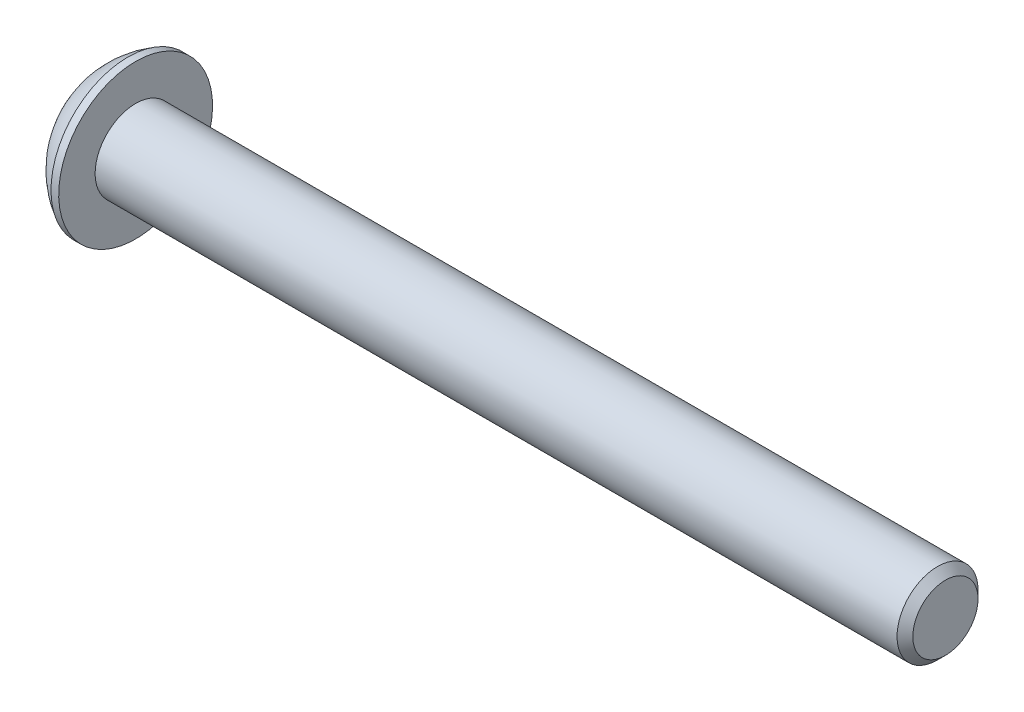
ISO-10303-21;
HEADER;
FILE_DESCRIPTION(('STEP AP214'),'2;1');
FILE_NAME('part.step','',(''),(''),'','','');
FILE_SCHEMA(('AUTOMOTIVE_DESIGN { 1 0 10303 214 1 1 1 1 }'));
ENDSEC;
DATA;
#1=APPLICATION_CONTEXT('core data for automotive mechanical design processes');
#2=APPLICATION_PROTOCOL_DEFINITION('international standard','automotive_design',2000,#1);
#3=PRODUCT_CONTEXT('',#1,'mechanical');
#4=PRODUCT('Part','Part','',(#3));
#5=PRODUCT_RELATED_PRODUCT_CATEGORY('part','',(#4));
#6=PRODUCT_DEFINITION_FORMATION('','',#4);
#7=PRODUCT_DEFINITION_CONTEXT('part definition',#1,'design');
#8=PRODUCT_DEFINITION('design','',#6,#7);
#9=PRODUCT_DEFINITION_SHAPE('','',#8);
#10=(LENGTH_UNIT() NAMED_UNIT(*) SI_UNIT(.MILLI.,.METRE.));
#11=(NAMED_UNIT(*) PLANE_ANGLE_UNIT() SI_UNIT($,.RADIAN.));
#12=(NAMED_UNIT(*) SI_UNIT($,.STERADIAN.) SOLID_ANGLE_UNIT());
#13=UNCERTAINTY_MEASURE_WITH_UNIT(LENGTH_MEASURE(1.E-05),#10,'distance_accuracy_value','');
#14=(GEOMETRIC_REPRESENTATION_CONTEXT(3) GLOBAL_UNCERTAINTY_ASSIGNED_CONTEXT((#13)) GLOBAL_UNIT_ASSIGNED_CONTEXT((#10,
#11,#12)) REPRESENTATION_CONTEXT('',''));
#15=CARTESIAN_POINT('',(0.,0.,0.));
#16=DIRECTION('',(0.,0.,1.));
#17=DIRECTION('',(1.,0.,0.));
#18=AXIS2_PLACEMENT_3D('',#15,#16,#17);
#19=CARTESIAN_POINT('',(0.,0.,0.));
#20=DIRECTION('',(1.,0.,0.));
#21=DIRECTION('',(0.,1.,0.));
#22=AXIS2_PLACEMENT_3D('',#19,#20,#21);
#23=PLANE('',#22);
#24=DIRECTION('',(0.,-1.,0.));
#25=VECTOR('',#24,1.);
#26=CARTESIAN_POINT('',(0.,0.721687836487032,-1.25));
#27=LINE('',#26,#25);
#28=CARTESIAN_POINT('',(0.,0.721687836487032,-1.25));
#29=VERTEX_POINT('',#28);
#30=CARTESIAN_POINT('',(0.,-0.721687836487033,-1.25));
#31=VERTEX_POINT('',#30);
#32=EDGE_CURVE('E121',#29,#31,#27,.T.);
#33=ORIENTED_EDGE('',*,*,#32,.F.);
#34=DIRECTION('',(0.,-0.5,-0.866025403784439));
#35=VECTOR('',#34,1.);
#36=CARTESIAN_POINT('',(0.,1.44337567297406,0.));
#37=LINE('',#36,#35);
#38=CARTESIAN_POINT('',(0.,1.44337567297406,0.));
#39=VERTEX_POINT('',#38);
#40=EDGE_CURVE('E47',#39,#29,#37,.T.);
#41=ORIENTED_EDGE('',*,*,#40,.F.);
#42=DIRECTION('',(0.,0.5,-0.866025403784439));
#43=VECTOR('',#42,1.);
#44=CARTESIAN_POINT('',(0.,0.721687836487033,1.25));
#45=LINE('',#44,#43);
#46=CARTESIAN_POINT('',(0.,0.721687836487033,1.25));
#47=VERTEX_POINT('',#46);
#48=EDGE_CURVE('E130',#47,#39,#45,.T.);
#49=ORIENTED_EDGE('',*,*,#48,.F.);
#50=DIRECTION('',(0.,1.,0.));
#51=VECTOR('',#50,1.);
#52=CARTESIAN_POINT('',(0.,-0.721687836487032,1.25));
#53=LINE('',#52,#51);
#54=CARTESIAN_POINT('',(0.,-0.721687836487032,1.25));
#55=VERTEX_POINT('',#54);
#56=EDGE_CURVE('E128',#55,#47,#53,.T.);
#57=ORIENTED_EDGE('',*,*,#56,.F.);
#58=DIRECTION('',(0.,0.5,0.866025403784439));
#59=VECTOR('',#58,1.);
#60=CARTESIAN_POINT('',(0.,-1.44337567297406,0.));
#61=LINE('',#60,#59);
#62=CARTESIAN_POINT('',(0.,-1.44337567297406,0.));
#63=VERTEX_POINT('',#62);
#64=EDGE_CURVE('E95',#63,#55,#61,.T.);
#65=ORIENTED_EDGE('',*,*,#64,.F.);
#66=DIRECTION('',(0.,-0.5,0.866025403784439));
#67=VECTOR('',#66,1.);
#68=CARTESIAN_POINT('',(0.,-0.721687836487033,-1.25));
#69=LINE('',#68,#67);
#70=EDGE_CURVE('E124',#31,#63,#69,.T.);
#71=ORIENTED_EDGE('',*,*,#70,.F.);
#72=EDGE_LOOP('',(#33,#41,#49,#57,#65,#71));
#73=FACE_BOUND('',#72,.T.);
#74=CARTESIAN_POINT('',(0.,0.,0.));
#75=DIRECTION('',(1.,0.,0.));
#76=DIRECTION('',(0.,1.,0.));
#77=AXIS2_PLACEMENT_3D('',#74,#75,#76);
#78=CIRCLE('',#77,1.9);
#79=CARTESIAN_POINT('',(0.,1.9,0.));
#80=VERTEX_POINT('',#79);
#81=EDGE_CURVE('E11',#80,#80,#78,.T.);
#82=ORIENTED_EDGE('',*,*,#81,.F.);
#83=EDGE_LOOP('',(#82));
#84=FACE_BOUND('',#83,.T.);
#85=ADVANCED_FACE('F33',(#73,#84),#23,.F.);
#86=CARTESIAN_POINT('',(3.88527472527473,0.,0.));
#87=DIRECTION('',(1.,0.,0.));
#88=DIRECTION('',(0.,1.,0.));
#89=AXIS2_PLACEMENT_3D('',#86,#87,#88);
#90=SPHERICAL_SURFACE('',#89,4.3249693283142);
#91=CARTESIAN_POINT('',(1.82,0.,0.));
#92=DIRECTION('',(1.,0.,0.));
#93=DIRECTION('',(0.,1.,0.));
#94=AXIS2_PLACEMENT_3D('',#91,#92,#93);
#95=CIRCLE('',#94,3.8);
#96=CARTESIAN_POINT('',(1.82,3.8,0.));
#97=VERTEX_POINT('',#96);
#98=EDGE_CURVE('E40',#97,#97,#95,.T.);
#99=CARTESIAN_POINT('',(1.82,3.8,0.));
#100=CARTESIAN_POINT('',(1.79553223778235,3.78670197498787,0.));
#101=CARTESIAN_POINT('',(1.77119294730718,3.77316757105695,0.));
#102=CARTESIAN_POINT('',(1.72278031308152,3.74563119292022,0.));
#103=CARTESIAN_POINT('',(1.69870696933104,3.73162921871441,0.));
#104=CARTESIAN_POINT('',(1.65083523179446,3.7031628875906,0.));
#105=CARTESIAN_POINT('',(1.62703683800837,3.6886985306726,0.));
#106=CARTESIAN_POINT('',(1.57972387446203,3.65931284095831,0.));
#107=CARTESIAN_POINT('',(1.55620930470177,3.64439150816202,0.));
#108=CARTESIAN_POINT('',(1.50947276449225,3.61409743150663,0.));
#109=CARTESIAN_POINT('',(1.48625079404298,3.59872468764754,0.));
#110=CARTESIAN_POINT('',(1.44010811665664,3.56753352546924,0.));
#111=CARTESIAN_POINT('',(1.41718740971957,3.55171510715004,0.));
#112=CARTESIAN_POINT('',(1.37165581166264,3.51963849804541,0.));
#113=CARTESIAN_POINT('',(1.34904492054277,3.50338030725998,0.));
#114=CARTESIAN_POINT('',(1.30414139068938,3.47043021954608,0.));
#115=CARTESIAN_POINT('',(1.28184875195586,3.45373832261761,0.));
#116=CARTESIAN_POINT('',(1.23759004473439,3.41992705070111,0.));
#117=CARTESIAN_POINT('',(1.21562397624644,3.40280767571308,0.));
#118=CARTESIAN_POINT('',(1.17202660551528,3.3681478352793,0.));
#119=CARTESIAN_POINT('',(1.15039530327208,3.35060736983354,0.));
#120=CARTESIAN_POINT('',(1.10747553612391,3.31511189319918,0.));
#121=CARTESIAN_POINT('',(1.08618707121895,3.29715688201057,0.));
#122=CARTESIAN_POINT('',(1.04396092192025,3.26083901328234,0.));
#123=CARTESIAN_POINT('',(1.02302323752652,3.24247615574272,0.));
#124=CARTESIAN_POINT('',(0.981506461539866,3.20534944588001,0.));
#125=CARTESIAN_POINT('',(0.960927369946953,3.18658559355691,0.));
#126=CARTESIAN_POINT('',(0.920135458053,3.14866389531445,0.));
#127=CARTESIAN_POINT('',(0.89992263775196,3.12950604939509,0.));
#128=CARTESIAN_POINT('',(0.859870810269304,3.09080351215454,0.));
#129=CARTESIAN_POINT('',(0.840031803087689,3.07125882083336,0.));
#130=CARTESIAN_POINT('',(0.800735004193913,3.0317898853238,0.));
#131=CARTESIAN_POINT('',(0.781277212481752,3.01186564113541,0.));
#132=CARTESIAN_POINT('',(0.74275010463742,2.97164503404517,0.));
#133=CARTESIAN_POINT('',(0.723680788505248,2.95134867114332,0.));
#134=CARTESIAN_POINT('',(0.685937746983035,2.91039139962521,0.));
#135=CARTESIAN_POINT('',(0.667264021592993,2.88973049100894,0.));
#136=CARTESIAN_POINT('',(0.630319129113973,2.84805183708071,0.));
#137=CARTESIAN_POINT('',(0.612047962024995,2.82703409176873,0.));
#138=CARTESIAN_POINT('',(0.575915003504076,2.78464960661105,0.));
#139=CARTESIAN_POINT('',(0.558053212072135,2.76328286676534,0.));
#140=CARTESIAN_POINT('',(0.522745669474638,2.72020836491933,0.));
#141=CARTESIAN_POINT('',(0.505299918309082,2.69850060291903,0.));
#142=CARTESIAN_POINT('',(0.470830965620254,2.65475215638556,0.));
#143=CARTESIAN_POINT('',(0.453807764096982,2.63271147185238,0.));
#144=CARTESIAN_POINT('',(0.420190262406822,2.58830540409509,0.));
#145=CARTESIAN_POINT('',(0.403595962239933,2.56594002087097,0.));
#146=CARTESIAN_POINT('',(0.370842454943266,2.52089290072626,0.));
#147=CARTESIAN_POINT('',(0.354683247813488,2.49821116380567,0.));
#148=CARTESIAN_POINT('',(0.32280595593417,2.45253979929826,0.));
#149=CARTESIAN_POINT('',(0.307087871184631,2.42955017171145,0.));
#150=CARTESIAN_POINT('',(0.27609868879919,2.3832716037914,0.));
#151=CARTESIAN_POINT('',(0.260827591163289,2.35998266345817,0.));
#152=CARTESIAN_POINT('',(0.230738081024335,2.31311415961106,0.));
#153=CARTESIAN_POINT('',(0.215919668521282,2.28953459609717,0.));
#154=CARTESIAN_POINT('',(0.186741057514275,2.24209364401867,0.));
#155=CARTESIAN_POINT('',(0.172380859010321,2.21823225545407,0.));
#156=CARTESIAN_POINT('',(0.144124034818957,2.17023655608655,0.));
#157=CARTESIAN_POINT('',(0.130227409131549,2.14610224528363,0.));
#158=CARTESIAN_POINT('',(0.102902912986766,2.09756970784785,0.));
#159=CARTESIAN_POINT('',(0.0894750425293912,2.07317148121498,0.));
#160=CARTESIAN_POINT('',(0.0630930771761361,2.02412021042083,0.));
#161=CARTESIAN_POINT('',(0.0501389822802555,1.99946716625955,0.));
#162=CARTESIAN_POINT('',(0.0247093637594976,1.94991547834233,0.));
#163=CARTESIAN_POINT('',(0.0122338401346203,1.9250168345864,0.));
#164=CARTESIAN_POINT('',(0.,1.9,0.));
#165=B_SPLINE_CURVE_WITH_KNOTS('',3,(#99,#100,#101,#102,#103,#104,#105,#106,#107,#108,#109,#110,
#111,#112,#113,#114,#115,#116,#117,#118,#119,#120,#121,#122,#123,#124,#125,#126,#127,#128,#129,
#130,#131,#132,#133,#134,#135,#136,#137,#138,#139,#140,#141,#142,#143,#144,#145,#146,#147,#148,
#149,#150,#151,#152,#153,#154,#155,#156,#157,#158,#159,#160,#161,#162,#163,#164),.UNSPECIFIED.,
.F.,.F.,(4,2,2,2,2,2,2,2,2,2,2,2,2,2,2,2,2,2,2,2,2,2,2,2,2,2,2,2,2,2,2,2,4),(0.,
0.083542578086179,0.167085156172358,0.250627734258537,0.334170312344717,0.417712890430896,
0.501255468517075,0.584798046603254,0.668340624689434,0.751883202775613,0.835425780861792,
0.918968358947972,1.00251093703415,1.08605351512033,1.16959609320651,1.25313867129269,
1.33668124937887,1.42022382746505,1.50376640555123,1.58730898363741,1.67085156172359,
1.75439413980976,1.83793671789594,1.92147929598212,2.0050218740683,2.08856445215448,
2.17210703024066,2.25564960832684,2.33919218641302,2.4227347644992,2.50627734258538,
2.58981992067156,2.67336249875774),.UNSPECIFIED.);
#166=EDGE_CURVE('BSEAM156',#97,#80,#165,.T.);
#167=ORIENTED_EDGE('',*,*,#98,.F.);
#168=ORIENTED_EDGE('',*,*,#81,.T.);
#169=ORIENTED_EDGE('',*,*,#166,.T.);
#170=ORIENTED_EDGE('',*,*,#166,.F.);
#171=EDGE_LOOP('',(#167,#169,#168,#170));
#172=FACE_BOUND('',#171,.T.);
#173=ADVANCED_FACE('F156',(#172),#90,.T.);
#174=CARTESIAN_POINT('',(42.2,0.,0.));
#175=DIRECTION('',(1.,0.,0.));
#176=DIRECTION('',(0.,1.,0.));
#177=AXIS2_PLACEMENT_3D('',#174,#175,#176);
#178=CYLINDRICAL_SURFACE('',#177,3.8);
#179=ORIENTED_EDGE('',*,*,#98,.T.);
#180=EDGE_LOOP('',(#179));
#181=FACE_BOUND('',#180,.T.);
#182=CARTESIAN_POINT('',(2.2,0.,0.));
#183=DIRECTION('',(1.,0.,0.));
#184=DIRECTION('',(0.,1.,0.));
#185=AXIS2_PLACEMENT_3D('',#182,#183,#184);
#186=CIRCLE('',#185,3.8);
#187=CARTESIAN_POINT('',(2.2,3.8,0.));
#188=VERTEX_POINT('',#187);
#189=EDGE_CURVE('E148',#188,#188,#186,.T.);
#190=ORIENTED_EDGE('',*,*,#189,.F.);
#191=EDGE_LOOP('',(#190));
#192=FACE_BOUND('',#191,.T.);
#193=ADVANCED_FACE('F153',(#181,#192),#178,.T.);
#194=CARTESIAN_POINT('',(2.2,2.,0.));
#195=DIRECTION('',(1.,0.,0.));
#196=DIRECTION('',(0.,1.,0.));
#197=AXIS2_PLACEMENT_3D('',#194,#195,#196);
#198=PLANE('',#197);
#199=ORIENTED_EDGE('',*,*,#189,.T.);
#200=EDGE_LOOP('',(#199));
#201=FACE_BOUND('',#200,.T.);
#202=CARTESIAN_POINT('',(2.2,0.,0.));
#203=DIRECTION('',(1.,0.,0.));
#204=DIRECTION('',(0.,1.,0.));
#205=AXIS2_PLACEMENT_3D('',#202,#203,#204);
#206=CIRCLE('',#205,2.);
#207=CARTESIAN_POINT('',(2.2,2.,0.));
#208=VERTEX_POINT('',#207);
#209=EDGE_CURVE('E145',#208,#208,#206,.T.);
#210=ORIENTED_EDGE('',*,*,#209,.F.);
#211=EDGE_LOOP('',(#210));
#212=FACE_BOUND('',#211,.T.);
#213=ADVANCED_FACE('F193',(#201,#212),#198,.T.);
#214=CARTESIAN_POINT('',(42.2,0.,0.));
#215=DIRECTION('',(1.,0.,0.));
#216=DIRECTION('',(0.,1.,0.));
#217=AXIS2_PLACEMENT_3D('',#214,#215,#216);
#218=CYLINDRICAL_SURFACE('',#217,2.);
#219=ORIENTED_EDGE('',*,*,#209,.T.);
#220=EDGE_LOOP('',(#219));
#221=FACE_BOUND('',#220,.T.);
#222=CARTESIAN_POINT('',(41.81,0.,0.));
#223=DIRECTION('',(1.,0.,0.));
#224=DIRECTION('',(0.,1.,0.));
#225=AXIS2_PLACEMENT_3D('',#222,#223,#224);
#226=CIRCLE('',#225,2.);
#227=CARTESIAN_POINT('',(41.81,2.,0.));
#228=VERTEX_POINT('',#227);
#229=EDGE_CURVE('E142',#228,#228,#226,.T.);
#230=ORIENTED_EDGE('',*,*,#229,.F.);
#231=EDGE_LOOP('',(#230));
#232=FACE_BOUND('',#231,.T.);
#233=ADVANCED_FACE('F189',(#221,#232),#218,.T.);
#234=CARTESIAN_POINT('',(42.2,0.,0.));
#235=DIRECTION('',(-1.,0.,0.));
#236=DIRECTION('',(0.,-1.,0.));
#237=AXIS2_PLACEMENT_3D('',#234,#235,#236);
#238=CONICAL_SURFACE('',#237,1.61,0.785398163397449);
#239=ORIENTED_EDGE('',*,*,#229,.T.);
#240=EDGE_LOOP('',(#239));
#241=FACE_BOUND('',#240,.T.);
#242=CARTESIAN_POINT('',(42.2,0.,0.));
#243=DIRECTION('',(1.,0.,0.));
#244=DIRECTION('',(0.,1.,0.));
#245=AXIS2_PLACEMENT_3D('',#242,#243,#244);
#246=CIRCLE('',#245,1.61);
#247=CARTESIAN_POINT('',(42.2,1.61,0.));
#248=VERTEX_POINT('',#247);
#249=EDGE_CURVE('E134',#248,#248,#246,.T.);
#250=ORIENTED_EDGE('',*,*,#249,.F.);
#251=EDGE_LOOP('',(#250));
#252=FACE_BOUND('',#251,.T.);
#253=ADVANCED_FACE('F181',(#241,#252),#238,.T.);
#254=CARTESIAN_POINT('',(42.2,0.,0.));
#255=DIRECTION('',(1.,0.,0.));
#256=DIRECTION('',(0.,1.,0.));
#257=AXIS2_PLACEMENT_3D('',#254,#255,#256);
#258=PLANE('',#257);
#259=ORIENTED_EDGE('',*,*,#249,.T.);
#260=EDGE_LOOP('',(#259));
#261=FACE_BOUND('',#260,.T.);
#262=ADVANCED_FACE('F174',(#261),#258,.T.);
#263=CARTESIAN_POINT('',(1.5,1.44337567297406,0.));
#264=DIRECTION('',(0.,0.866025403784439,-0.5));
#265=DIRECTION('',(0.,0.5,0.866025403784439));
#266=AXIS2_PLACEMENT_3D('',#263,#264,#265);
#267=PLANE('',#266);
#268=ORIENTED_EDGE('',*,*,#40,.T.);
#269=DIRECTION('',(-1.,0.,0.));
#270=VECTOR('',#269,1.);
#271=CARTESIAN_POINT('',(1.5,0.721687836487032,-1.25));
#272=LINE('',#271,#270);
#273=CARTESIAN_POINT('',(1.5,0.721687836487032,-1.25));
#274=VERTEX_POINT('',#273);
#275=EDGE_CURVE('E77',#274,#29,#272,.T.);
#276=ORIENTED_EDGE('',*,*,#275,.F.);
#277=DIRECTION('',(0.,-0.5,-0.866025403784439));
#278=VECTOR('',#277,1.);
#279=CARTESIAN_POINT('',(1.5,1.44337567297406,0.));
#280=LINE('',#279,#278);
#281=CARTESIAN_POINT('',(1.5,1.44337567297406,0.));
#282=VERTEX_POINT('',#281);
#283=EDGE_CURVE('E132',#282,#274,#280,.T.);
#284=ORIENTED_EDGE('',*,*,#283,.F.);
#285=DIRECTION('',(-1.,0.,0.));
#286=VECTOR('',#285,1.);
#287=CARTESIAN_POINT('',(1.5,1.44337567297406,0.));
#288=LINE('',#287,#286);
#289=EDGE_CURVE('E55',#282,#39,#288,.T.);
#290=ORIENTED_EDGE('',*,*,#289,.T.);
#291=EDGE_LOOP('',(#268,#276,#284,#290));
#292=FACE_BOUND('',#291,.T.);
#293=ADVANCED_FACE('F171',(#292),#267,.F.);
#294=CARTESIAN_POINT('',(1.5,0.721687836487033,1.25));
#295=DIRECTION('',(0.,0.866025403784439,0.5));
#296=DIRECTION('',(0.,-0.5,0.866025403784439));
#297=AXIS2_PLACEMENT_3D('',#294,#295,#296);
#298=PLANE('',#297);
#299=ORIENTED_EDGE('',*,*,#48,.T.);
#300=ORIENTED_EDGE('',*,*,#289,.F.);
#301=DIRECTION('',(0.,0.5,-0.866025403784439));
#302=VECTOR('',#301,1.);
#303=CARTESIAN_POINT('',(1.5,0.721687836487033,1.25));
#304=LINE('',#303,#302);
#305=CARTESIAN_POINT('',(1.5,0.721687836487033,1.25));
#306=VERTEX_POINT('',#305);
#307=EDGE_CURVE('E107',#306,#282,#304,.T.);
#308=ORIENTED_EDGE('',*,*,#307,.F.);
#309=DIRECTION('',(-1.,0.,0.));
#310=VECTOR('',#309,1.);
#311=CARTESIAN_POINT('',(1.5,0.721687836487033,1.25));
#312=LINE('',#311,#310);
#313=EDGE_CURVE('E99',#306,#47,#312,.T.);
#314=ORIENTED_EDGE('',*,*,#313,.T.);
#315=EDGE_LOOP('',(#299,#300,#308,#314));
#316=FACE_BOUND('',#315,.T.);
#317=ADVANCED_FACE('F173',(#316),#298,.F.);
#318=CARTESIAN_POINT('',(1.5,-0.721687836487032,1.25));
#319=DIRECTION('',(0.,0.,1.));
#320=DIRECTION('',(0.,-1.,0.));
#321=AXIS2_PLACEMENT_3D('',#318,#319,#320);
#322=PLANE('',#321);
#323=ORIENTED_EDGE('',*,*,#56,.T.);
#324=ORIENTED_EDGE('',*,*,#313,.F.);
#325=DIRECTION('',(0.,1.,0.));
#326=VECTOR('',#325,1.);
#327=CARTESIAN_POINT('',(1.5,-0.721687836487032,1.25));
#328=LINE('',#327,#326);
#329=CARTESIAN_POINT('',(1.5,-0.721687836487032,1.25));
#330=VERTEX_POINT('',#329);
#331=EDGE_CURVE('E103',#330,#306,#328,.T.);
#332=ORIENTED_EDGE('',*,*,#331,.F.);
#333=DIRECTION('',(-1.,0.,0.));
#334=VECTOR('',#333,1.);
#335=CARTESIAN_POINT('',(1.5,-0.721687836487032,1.25));
#336=LINE('',#335,#334);
#337=EDGE_CURVE('E88',#330,#55,#336,.T.);
#338=ORIENTED_EDGE('',*,*,#337,.T.);
#339=EDGE_LOOP('',(#323,#324,#332,#338));
#340=FACE_BOUND('',#339,.T.);
#341=ADVANCED_FACE('F104',(#340),#322,.F.);
#342=CARTESIAN_POINT('',(1.5,-1.44337567297406,0.));
#343=DIRECTION('',(0.,-0.866025403784439,0.5));
#344=DIRECTION('',(0.,-0.5,-0.866025403784439));
#345=AXIS2_PLACEMENT_3D('',#342,#343,#344);
#346=PLANE('',#345);
#347=ORIENTED_EDGE('',*,*,#64,.T.);
#348=ORIENTED_EDGE('',*,*,#337,.F.);
#349=DIRECTION('',(0.,0.5,0.866025403784439));
#350=VECTOR('',#349,1.);
#351=CARTESIAN_POINT('',(1.5,-1.44337567297406,0.));
#352=LINE('',#351,#350);
#353=CARTESIAN_POINT('',(1.5,-1.44337567297406,0.));
#354=VERTEX_POINT('',#353);
#355=EDGE_CURVE('E92',#354,#330,#352,.T.);
#356=ORIENTED_EDGE('',*,*,#355,.F.);
#357=DIRECTION('',(-1.,0.,0.));
#358=VECTOR('',#357,1.);
#359=CARTESIAN_POINT('',(1.5,-1.44337567297406,0.));
#360=LINE('',#359,#358);
#361=EDGE_CURVE('E100',#354,#63,#360,.T.);
#362=ORIENTED_EDGE('',*,*,#361,.T.);
#363=EDGE_LOOP('',(#347,#348,#356,#362));
#364=FACE_BOUND('',#363,.T.);
#365=ADVANCED_FACE('F90',(#364),#346,.F.);
#366=CARTESIAN_POINT('',(1.5,-0.721687836487032,-1.25));
#367=DIRECTION('',(0.,-0.866025403784439,-0.5));
#368=DIRECTION('',(0.,0.5,-0.866025403784439));
#369=AXIS2_PLACEMENT_3D('',#366,#367,#368);
#370=PLANE('',#369);
#371=ORIENTED_EDGE('',*,*,#70,.T.);
#372=ORIENTED_EDGE('',*,*,#361,.F.);
#373=DIRECTION('',(0.,-0.5,0.866025403784439));
#374=VECTOR('',#373,1.);
#375=CARTESIAN_POINT('',(1.5,-0.721687836487032,-1.25));
#376=LINE('',#375,#374);
#377=CARTESIAN_POINT('',(1.5,-0.721687836487032,-1.25));
#378=VERTEX_POINT('',#377);
#379=EDGE_CURVE('E113',#378,#354,#376,.T.);
#380=ORIENTED_EDGE('',*,*,#379,.F.);
#381=DIRECTION('',(-1.,0.,0.));
#382=VECTOR('',#381,1.);
#383=CARTESIAN_POINT('',(1.5,-0.721687836487032,-1.25));
#384=LINE('',#383,#382);
#385=EDGE_CURVE('E137',#378,#31,#384,.T.);
#386=ORIENTED_EDGE('',*,*,#385,.T.);
#387=EDGE_LOOP('',(#371,#372,#380,#386));
#388=FACE_BOUND('',#387,.T.);
#389=ADVANCED_FACE('F251',(#388),#370,.F.);
#390=CARTESIAN_POINT('',(1.5,0.721687836487032,-1.25));
#391=DIRECTION('',(0.,0.,-1.));
#392=DIRECTION('',(0.,1.,0.));
#393=AXIS2_PLACEMENT_3D('',#390,#391,#392);
#394=PLANE('',#393);
#395=ORIENTED_EDGE('',*,*,#32,.T.);
#396=ORIENTED_EDGE('',*,*,#385,.F.);
#397=DIRECTION('',(0.,-1.,0.));
#398=VECTOR('',#397,1.);
#399=CARTESIAN_POINT('',(1.5,0.721687836487032,-1.25));
#400=LINE('',#399,#398);
#401=EDGE_CURVE('E115',#274,#378,#400,.T.);
#402=ORIENTED_EDGE('',*,*,#401,.F.);
#403=ORIENTED_EDGE('',*,*,#275,.T.);
#404=EDGE_LOOP('',(#395,#396,#402,#403));
#405=FACE_BOUND('',#404,.T.);
#406=ADVANCED_FACE('F169',(#405),#394,.F.);
#407=CARTESIAN_POINT('',(1.5,0.,0.));
#408=DIRECTION('',(-1.,0.,0.));
#409=DIRECTION('',(0.,-1.,0.));
#410=AXIS2_PLACEMENT_3D('',#407,#408,#409);
#411=PLANE('',#410);
#412=ORIENTED_EDGE('',*,*,#283,.T.);
#413=ORIENTED_EDGE('',*,*,#401,.T.);
#414=ORIENTED_EDGE('',*,*,#379,.T.);
#415=ORIENTED_EDGE('',*,*,#355,.T.);
#416=ORIENTED_EDGE('',*,*,#331,.T.);
#417=ORIENTED_EDGE('',*,*,#307,.T.);
#418=EDGE_LOOP('',(#412,#413,#414,#415,#416,#417));
#419=FACE_BOUND('',#418,.T.);
#420=ADVANCED_FACE('F110',(#419),#411,.T.);
#421=CLOSED_SHELL('',(#85,#173,#193,#213,#233,#253,#262,#293,#317,#341,#365,#389,#406,#420));
#422=MANIFOLD_SOLID_BREP('B2',#421);
#423=ADVANCED_BREP_SHAPE_REPRESENTATION('',(#18,#422),#14);
#424=SHAPE_DEFINITION_REPRESENTATION(#9,#423);
ENDSEC;
END-ISO-10303-21;
